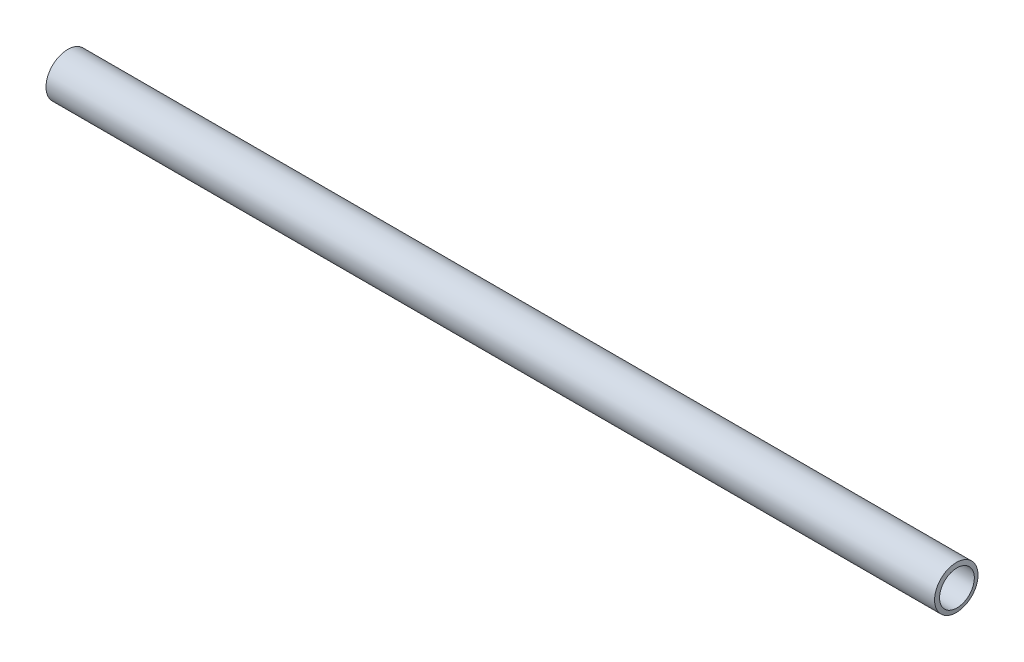
ISO-10303-21;
HEADER;
FILE_DESCRIPTION(('STEP AP214'),'2;1');
FILE_NAME('part.step','',(''),(''),'','','');
FILE_SCHEMA(('AUTOMOTIVE_DESIGN { 1 0 10303 214 1 1 1 1 }'));
ENDSEC;
DATA;
#1=APPLICATION_CONTEXT('core data for automotive mechanical design processes');
#2=APPLICATION_PROTOCOL_DEFINITION('international standard','automotive_design',2000,#1);
#3=PRODUCT_CONTEXT('',#1,'mechanical');
#4=PRODUCT('Part','Part','',(#3));
#5=PRODUCT_RELATED_PRODUCT_CATEGORY('part','',(#4));
#6=PRODUCT_DEFINITION_FORMATION('','',#4);
#7=PRODUCT_DEFINITION_CONTEXT('part definition',#1,'design');
#8=PRODUCT_DEFINITION('design','',#6,#7);
#9=PRODUCT_DEFINITION_SHAPE('','',#8);
#10=(LENGTH_UNIT() NAMED_UNIT(*) SI_UNIT(.MILLI.,.METRE.));
#11=(NAMED_UNIT(*) PLANE_ANGLE_UNIT() SI_UNIT($,.RADIAN.));
#12=(NAMED_UNIT(*) SI_UNIT($,.STERADIAN.) SOLID_ANGLE_UNIT());
#13=UNCERTAINTY_MEASURE_WITH_UNIT(LENGTH_MEASURE(1.E-05),#10,'distance_accuracy_value','');
#14=(GEOMETRIC_REPRESENTATION_CONTEXT(3) GLOBAL_UNCERTAINTY_ASSIGNED_CONTEXT((#13)) GLOBAL_UNIT_ASSIGNED_CONTEXT((#10,
#11,#12)) REPRESENTATION_CONTEXT('',''));
#15=CARTESIAN_POINT('',(0.,0.,0.));
#16=DIRECTION('',(0.,0.,1.));
#17=DIRECTION('',(1.,0.,0.));
#18=AXIS2_PLACEMENT_3D('',#15,#16,#17);
#19=CARTESIAN_POINT('',(-266.7,0.,0.));
#20=DIRECTION('',(1.,0.,0.));
#21=DIRECTION('',(0.,1.,0.));
#22=AXIS2_PLACEMENT_3D('',#19,#20,#21);
#23=CYLINDRICAL_SURFACE('',#22,10.16);
#24=CARTESIAN_POINT('',(-520.7,0.,0.));
#25=DIRECTION('',(1.,0.,0.));
#26=DIRECTION('',(0.,1.,0.));
#27=AXIS2_PLACEMENT_3D('',#24,#25,#26);
#28=CIRCLE('',#27,10.16);
#29=CARTESIAN_POINT('',(-520.7,10.16,0.));
#30=VERTEX_POINT('',#29);
#31=EDGE_CURVE('E59',#30,#30,#28,.T.);
#32=ORIENTED_EDGE('',*,*,#31,.F.);
#33=EDGE_LOOP('',(#32));
#34=FACE_BOUND('',#33,.T.);
#35=CARTESIAN_POINT('',(-0.680370763621985,0.,0.));
#36=DIRECTION('',(1.,0.,0.));
#37=DIRECTION('',(0.,1.,0.));
#38=AXIS2_PLACEMENT_3D('',#35,#36,#37);
#39=CIRCLE('',#38,10.16);
#40=CARTESIAN_POINT('',(-0.680370763621999,10.16,0.));
#41=VERTEX_POINT('',#40);
#42=EDGE_CURVE('E10',#41,#41,#39,.T.);
#43=ORIENTED_EDGE('',*,*,#42,.T.);
#44=EDGE_LOOP('',(#43));
#45=FACE_BOUND('',#44,.T.);
#46=ADVANCED_FACE('F42',(#34,#45),#23,.F.);
#47=CARTESIAN_POINT('',(-76.2,0.,0.));
#48=DIRECTION('',(1.,0.,0.));
#49=DIRECTION('',(0.,1.,0.));
#50=AXIS2_PLACEMENT_3D('',#47,#48,#49);
#51=SPHERICAL_SURFACE('',#50,76.2);
#52=CARTESIAN_POINT('',(-1.06578675463487,0.,0.));
#53=DIRECTION('',(1.,0.,0.));
#54=DIRECTION('',(0.,1.,0.));
#55=AXIS2_PLACEMENT_3D('',#52,#53,#54);
#56=CIRCLE('',#55,12.7);
#57=CARTESIAN_POINT('',(-1.06578675463488,12.7,0.));
#58=VERTEX_POINT('',#57);
#59=EDGE_CURVE('E49',#58,#58,#56,.T.);
#60=CARTESIAN_POINT('',(-1.06578675463488,12.7,0.));
#61=CARTESIAN_POINT('',(-1.06132634399825,12.673611854842,0.));
#62=CARTESIAN_POINT('',(-1.05687983517918,12.6472213598481,0.));
#63=CARTESIAN_POINT('',(-1.04801462608817,12.5944356994897,0.));
#64=CARTESIAN_POINT('',(-1.04359592581622,12.5680405341254,0.));
#65=CARTESIAN_POINT('',(-1.03478633873141,12.515245562328,0.));
#66=CARTESIAN_POINT('',(-1.03039545191855,12.488845755895,0.));
#67=CARTESIAN_POINT('',(-1.02164149662473,12.4360415312685,0.));
#68=CARTESIAN_POINT('',(-1.01727842814378,12.409637113075,0.));
#69=CARTESIAN_POINT('',(-1.00858011435795,12.3568236942406,0.));
#70=CARTESIAN_POINT('',(-1.00424486905308,12.3304146935997,0.));
#71=CARTESIAN_POINT('',(-0.995602206432094,12.2775921391886,0.));
#72=CARTESIAN_POINT('',(-0.991294789115983,12.2511785854184,0.));
#73=CARTESIAN_POINT('',(-0.982707787254471,12.198346954072,0.));
#74=CARTESIAN_POINT('',(-0.978428202709072,12.1719288764958,0.));
#75=CARTESIAN_POINT('',(-0.969896871139967,12.1190882268655,0.));
#76=CARTESIAN_POINT('',(-0.965645124116263,12.0926656548115,0.));
#77=CARTESIAN_POINT('',(-0.957169472310695,12.0398160455588,0.));
#78=CARTESIAN_POINT('',(-0.952945567528832,12.0133890083601,0.));
#79=CARTESIAN_POINT('',(-0.944525604896115,11.9605304981564,0.));
#80=CARTESIAN_POINT('',(-0.940329547045262,11.9340990251514,0.));
#81=CARTESIAN_POINT('',(-0.931965282932876,11.8812316726779,0.));
#82=CARTESIAN_POINT('',(-0.927797076671343,11.8547957932096,0.));
#83=CARTESIAN_POINT('',(-0.919488520364942,11.8019196571575,0.));
#84=CARTESIAN_POINT('',(-0.915348170320074,11.7754794005738,0.));
#85=CARTESIAN_POINT('',(-0.907095331043467,11.722594539644,0.));
#86=CARTESIAN_POINT('',(-0.902982841811727,11.6961499352979,0.));
#87=CARTESIAN_POINT('',(-0.894785728726868,11.6432564082008,0.));
#88=CARTESIAN_POINT('',(-0.890701104873747,11.6168074854499,0.));
#89=CARTESIAN_POINT('',(-0.882559727080728,11.5639053509058,0.));
#90=CARTESIAN_POINT('',(-0.878502973140829,11.5374521391126,0.));
#91=CARTESIAN_POINT('',(-0.870417339677873,11.4845414558511,0.));
#92=CARTESIAN_POINT('',(-0.866388460154817,11.4580839843829,0.));
#93=CARTESIAN_POINT('',(-0.858358579998229,11.4051648111433,0.));
#94=CARTESIAN_POINT('',(-0.854357579364698,11.3787031093719,0.));
#95=CARTESIAN_POINT('',(-0.846383461428926,11.3257755049028,0.));
#96=CARTESIAN_POINT('',(-0.842410344126684,11.299309602205,0.));
#97=CARTESIAN_POINT('',(-0.834491997264268,11.2463736252644,0.));
#98=CARTESIAN_POINT('',(-0.830546767704092,11.2199035510216,0.));
#99=CARTESIAN_POINT('',(-0.822684200705626,11.1669592603767,0.));
#100=CARTESIAN_POINT('',(-0.818766863267335,11.1404850439747,0.));
#101=CARTESIAN_POINT('',(-0.810960084861516,11.0875324984022,0.));
#102=CARTESIAN_POINT('',(-0.807070643893987,11.0610541692316,0.));
#103=CARTESIAN_POINT('',(-0.799319662747572,11.008093427517,0.));
#104=CARTESIAN_POINT('',(-0.795458122568686,10.981611014973,0.));
#105=CARTESIAN_POINT('',(-0.787762947286487,10.9286421359111,0.));
#106=CARTESIAN_POINT('',(-0.783929312183174,10.9021556693933,0.));
#107=CARTESIAN_POINT('',(-0.776289951308057,10.849178711788,0.));
#108=CARTESIAN_POINT('',(-0.772484225536253,10.8226882207006,0.));
#109=CARTESIAN_POINT('',(-0.764900687549108,10.7697032433646,0.));
#110=CARTESIAN_POINT('',(-0.761122875333768,10.7432087571162,0.));
#111=CARTESIAN_POINT('',(-0.753595168653515,10.6902158188713,0.));
#112=CARTESIAN_POINT('',(-0.749845274188603,10.6637173668748,0.));
#113=CARTESIAN_POINT('',(-0.742373407172188,10.6107165265515,0.));
#114=CARTESIAN_POINT('',(-0.738651434620685,10.5842141382246,0.));
#115=CARTESIAN_POINT('',(-0.731235415563048,10.5312054546621,0.));
#116=CARTESIAN_POINT('',(-0.727541369056914,10.5046991594265,0.));
#117=CARTESIAN_POINT('',(-0.720181206191086,10.4516826914728,0.));
#118=CARTESIAN_POINT('',(-0.716515089831391,10.4251725187548,0.));
#119=CARTESIAN_POINT('',(-0.709210791327966,10.3721483252666,0.));
#120=CARTESIAN_POINT('',(-0.705572609184235,10.3456343044966,0.));
#121=CARTESIAN_POINT('',(-0.698324183153447,10.2926024443391,0.));
#122=CARTESIAN_POINT('',(-0.694713939266389,10.2660846049516,0.));
#123=CARTESIAN_POINT('',(-0.687521393750318,10.213045136999,0.));
#124=CARTESIAN_POINT('',(-0.683939092121304,10.1865235084339,0.));
#125=CARTESIAN_POINT('',(-0.680370763621999,10.16,0.));
#126=B_SPLINE_CURVE_WITH_KNOTS('',3,(#60,#61,#62,#63,#64,#65,#66,#67,#68,#69,#70,#71,#72,#73,
#74,#75,#76,#77,#78,#79,#80,#81,#82,#83,#84,#85,#86,#87,#88,#89,#90,#91,#92,#93,#94,#95,#96,#97,
#98,#99,#100,#101,#102,#103,#104,#105,#106,#107,#108,#109,#110,#111,#112,#113,#114,#115,#116,
#117,#118,#119,#120,#121,#122,#123,#124,#125),.UNSPECIFIED.,.F.,.F.,(4,2,2,2,2,2,2,2,2,2,2,2,2,
2,2,2,2,2,2,2,2,2,2,2,2,2,2,2,2,2,2,2,4),(0.,0.0802873876456445,0.160574775291286,
0.240862162936911,0.321149550582556,0.401436938228201,0.481724325873845,0.562011713519485,
0.642299101165114,0.722586488810756,0.802873876456399,0.883161264102041,0.963448651747686,
1.04373603939333,1.12402342703896,1.2043108146846,1.28459820233024,1.36488558997589,
1.44517297762153,1.52546036526715,1.6057477529128,1.68603514055844,1.76632252820409,
1.84660991584973,1.92689730349537,2.007184691141,2.08747207878664,2.16775946643229,
2.24804685407793,2.32833424172357,2.4086216293692,2.48890901701484,2.56919640466049),.UNSPECIFIED.);
#127=EDGE_CURVE('BSEAM69',#58,#41,#126,.T.);
#128=ORIENTED_EDGE('',*,*,#59,.T.);
#129=ORIENTED_EDGE('',*,*,#42,.F.);
#130=ORIENTED_EDGE('',*,*,#127,.T.);
#131=ORIENTED_EDGE('',*,*,#127,.F.);
#132=EDGE_LOOP('',(#128,#130,#129,#131));
#133=FACE_BOUND('',#132,.T.);
#134=ADVANCED_FACE('F69',(#133),#51,.T.);
#135=CARTESIAN_POINT('',(-266.7,0.,0.));
#136=DIRECTION('',(1.,0.,0.));
#137=DIRECTION('',(0.,1.,0.));
#138=AXIS2_PLACEMENT_3D('',#135,#136,#137);
#139=CYLINDRICAL_SURFACE('',#138,12.7);
#140=CARTESIAN_POINT('',(-520.7,0.,0.));
#141=DIRECTION('',(1.,0.,0.));
#142=DIRECTION('',(0.,1.,0.));
#143=AXIS2_PLACEMENT_3D('',#140,#141,#142);
#144=CIRCLE('',#143,12.7);
#145=CARTESIAN_POINT('',(-520.7,12.7,0.));
#146=VERTEX_POINT('',#145);
#147=EDGE_CURVE('E54',#146,#146,#144,.T.);
#148=ORIENTED_EDGE('',*,*,#147,.T.);
#149=EDGE_LOOP('',(#148));
#150=FACE_BOUND('',#149,.T.);
#151=ORIENTED_EDGE('',*,*,#59,.F.);
#152=EDGE_LOOP('',(#151));
#153=FACE_BOUND('',#152,.T.);
#154=ADVANCED_FACE('F73',(#150,#153),#139,.T.);
#155=CARTESIAN_POINT('',(-520.7,0.,0.));
#156=DIRECTION('',(1.,0.,0.));
#157=DIRECTION('',(0.,1.,0.));
#158=AXIS2_PLACEMENT_3D('',#155,#156,#157);
#159=PLANE('',#158);
#160=ORIENTED_EDGE('',*,*,#147,.F.);
#161=EDGE_LOOP('',(#160));
#162=FACE_BOUND('',#161,.T.);
#163=ORIENTED_EDGE('',*,*,#31,.T.);
#164=EDGE_LOOP('',(#163));
#165=FACE_BOUND('',#164,.T.);
#166=ADVANCED_FACE('F66',(#162,#165),#159,.F.);
#167=CLOSED_SHELL('',(#46,#134,#154,#166));
#168=MANIFOLD_SOLID_BREP('B2',#167);
#169=ADVANCED_BREP_SHAPE_REPRESENTATION('',(#18,#168),#14);
#170=SHAPE_DEFINITION_REPRESENTATION(#9,#169);
ENDSEC;
END-ISO-10303-21;
